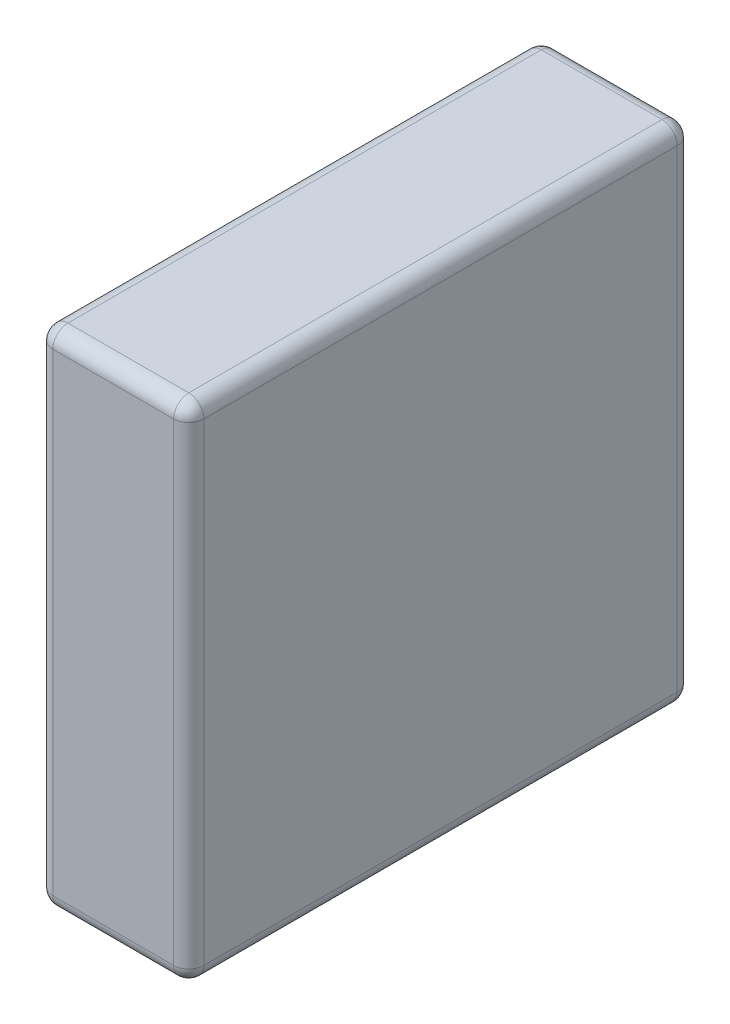
ISO-10303-21;
HEADER;
FILE_DESCRIPTION(('STEP AP214'),'2;1');
FILE_NAME('part.step','',(''),(''),'','','');
FILE_SCHEMA(('AUTOMOTIVE_DESIGN { 1 0 10303 214 1 1 1 1 }'));
ENDSEC;
DATA;
#1=APPLICATION_CONTEXT('core data for automotive mechanical design processes');
#2=APPLICATION_PROTOCOL_DEFINITION('international standard','automotive_design',2000,#1);
#3=PRODUCT_CONTEXT('',#1,'mechanical');
#4=PRODUCT('Part','Part','',(#3));
#5=PRODUCT_RELATED_PRODUCT_CATEGORY('part','',(#4));
#6=PRODUCT_DEFINITION_FORMATION('','',#4);
#7=PRODUCT_DEFINITION_CONTEXT('part definition',#1,'design');
#8=PRODUCT_DEFINITION('design','',#6,#7);
#9=PRODUCT_DEFINITION_SHAPE('','',#8);
#10=(LENGTH_UNIT() NAMED_UNIT(*) SI_UNIT(.MILLI.,.METRE.));
#11=(NAMED_UNIT(*) PLANE_ANGLE_UNIT() SI_UNIT($,.RADIAN.));
#12=(NAMED_UNIT(*) SI_UNIT($,.STERADIAN.) SOLID_ANGLE_UNIT());
#13=UNCERTAINTY_MEASURE_WITH_UNIT(LENGTH_MEASURE(1.E-05),#10,'distance_accuracy_value','');
#14=(GEOMETRIC_REPRESENTATION_CONTEXT(3) GLOBAL_UNCERTAINTY_ASSIGNED_CONTEXT((#13)) GLOBAL_UNIT_ASSIGNED_CONTEXT((#10,
#11,#12)) REPRESENTATION_CONTEXT('',''));
#15=CARTESIAN_POINT('',(0.,0.,0.));
#16=DIRECTION('',(0.,0.,1.));
#17=DIRECTION('',(1.,0.,0.));
#18=AXIS2_PLACEMENT_3D('',#15,#16,#17);
#19=CARTESIAN_POINT('',(25.215,25.745,-0.00960000038147));
#20=DIRECTION('',(1.,0.,0.));
#21=DIRECTION('',(0.,1.,0.));
#22=AXIS2_PLACEMENT_3D('',#19,#20,#21);
#23=PLANE('',#22);
#24=DIRECTION('',(0.,-1.,0.));
#25=VECTOR('',#24,1.);
#26=CARTESIAN_POINT('',(25.215,25.745,-0.479600000381));
#27=LINE('',#26,#25);
#28=CARTESIAN_POINT('',(25.215,26.215,-0.479600000381));
#29=VERTEX_POINT('',#28);
#30=CARTESIAN_POINT('',(25.215,25.745,-0.479600000381));
#31=VERTEX_POINT('',#30);
#32=EDGE_CURVE('E28',#29,#31,#27,.T.);
#33=ORIENTED_EDGE('',*,*,#32,.T.);
#34=DIRECTION('',(0.,0.,1.));
#35=VECTOR('',#34,1.);
#36=CARTESIAN_POINT('',(25.215,25.745,-0.00960000038147));
#37=LINE('',#36,#35);
#38=CARTESIAN_POINT('',(25.215,25.745,-0.00960000038147));
#39=VERTEX_POINT('',#38);
#40=EDGE_CURVE('E11',#31,#39,#37,.T.);
#41=ORIENTED_EDGE('',*,*,#40,.T.);
#42=DIRECTION('',(0.,-1.,0.));
#43=VECTOR('',#42,1.);
#44=CARTESIAN_POINT('',(25.215,25.745,-0.00960000038147));
#45=LINE('',#44,#43);
#46=CARTESIAN_POINT('',(25.215,26.215,-0.00960000038147));
#47=VERTEX_POINT('',#46);
#48=EDGE_CURVE('E222',#47,#39,#45,.T.);
#49=ORIENTED_EDGE('',*,*,#48,.F.);
#50=DIRECTION('',(0.,0.,-1.));
#51=VECTOR('',#50,1.);
#52=CARTESIAN_POINT('',(25.215,26.215,-0.00960000038147));
#53=LINE('',#52,#51);
#54=EDGE_CURVE('E215',#47,#29,#53,.T.);
#55=ORIENTED_EDGE('',*,*,#54,.T.);
#56=EDGE_LOOP('',(#33,#41,#49,#55));
#57=FACE_BOUND('',#56,.T.);
#58=ADVANCED_FACE('F17',(#57),#23,.F.);
#59=CARTESIAN_POINT('',(24.245,25.745,-0.00960000038147));
#60=DIRECTION('',(0.,-1.,0.));
#61=DIRECTION('',(0.,0.,-1.));
#62=AXIS2_PLACEMENT_3D('',#59,#60,#61);
#63=PLANE('',#62);
#64=DIRECTION('',(0.,0.,-1.));
#65=VECTOR('',#64,1.);
#66=CARTESIAN_POINT('',(25.08,25.745,0.00539999961853));
#67=LINE('',#66,#65);
#68=CARTESIAN_POINT('',(25.08,25.745,-0.009600000381464));
#69=VERTEX_POINT('',#68);
#70=CARTESIAN_POINT('',(25.08,25.745,-0.479600000381));
#71=VERTEX_POINT('',#70);
#72=EDGE_CURVE('E265',#69,#71,#67,.T.);
#73=ORIENTED_EDGE('',*,*,#72,.F.);
#74=DIRECTION('',(-1.,0.,0.));
#75=VECTOR('',#74,1.);
#76=CARTESIAN_POINT('',(24.245,25.745,-0.00960000038147));
#77=LINE('',#76,#75);
#78=EDGE_CURVE('E264',#39,#69,#77,.T.);
#79=ORIENTED_EDGE('',*,*,#78,.F.);
#80=ORIENTED_EDGE('',*,*,#40,.F.);
#81=DIRECTION('',(-1.,0.,0.));
#82=VECTOR('',#81,1.);
#83=CARTESIAN_POINT('',(24.245,25.745,-0.479600000381));
#84=LINE('',#83,#82);
#85=EDGE_CURVE('E205',#31,#71,#84,.T.);
#86=ORIENTED_EDGE('',*,*,#85,.T.);
#87=EDGE_LOOP('',(#73,#79,#80,#86));
#88=FACE_BOUND('',#87,.T.);
#89=ADVANCED_FACE('F829',(#88),#63,.F.);
#90=CARTESIAN_POINT('',(25.095,25.745,-0.494600000382));
#91=CARTESIAN_POINT('',(25.095,25.745,-0.494600000382));
#92=CARTESIAN_POINT('',(25.095,25.745,-0.494600000382));
#93=CARTESIAN_POINT('',(25.095,25.745,-0.494600000382));
#94=CARTESIAN_POINT('',(25.094999999997,25.736213203436,-0.494600000382));
#95=CARTESIAN_POINT('',(25.089852813741,25.736213203437,-0.494600000382));
#96=CARTESIAN_POINT('',(25.086213203436,25.739852813744,-0.494600000382));
#97=CARTESIAN_POINT('',(25.086213203436,25.745,-0.494600000382));
#98=CARTESIAN_POINT('',(25.094999999995,25.73,-0.488386796946));
#99=CARTESIAN_POINT('',(25.086213203433,25.730000000003,-0.488386796946));
#100=CARTESIAN_POINT('',(25.08,25.736213203438,-0.488386796946));
#101=CARTESIAN_POINT('',(25.08,25.745,-0.488386796946));
#102=CARTESIAN_POINT('',(25.094999999995,25.73,-0.479600000381));
#103=CARTESIAN_POINT('',(25.086213203433,25.730000000003,-0.479600000381));
#104=CARTESIAN_POINT('',(25.08,25.736213203438,-0.479600000381));
#105=CARTESIAN_POINT('',(25.08,25.745,-0.479600000381));
#106=(BOUNDED_SURFACE() B_SPLINE_SURFACE(3,3,((#90,#91,#92,#93),(#94,#95,#96,#97),(#98,#99,#100,
#101),(#102,#103,#104,#105)),.UNSPECIFIED.,.F.,.F.,.F.) B_SPLINE_SURFACE_WITH_KNOTS((4,4),(4,4),
(0.,1.),(0.,1.),.UNSPECIFIED.) GEOMETRIC_REPRESENTATION_ITEM() RATIONAL_B_SPLINE_SURFACE(((1.,
0.804737854202,0.804737854202,1.),(0.804737854125,0.647603013923,0.647603013923,0.804737854125),
(0.804737854125,0.647603013923,0.647603013923,0.804737854125),(1.,0.804737854202,0.804737854202,1.))) REPRESENTATION_ITEM('') SURFACE());
#107=CARTESIAN_POINT('',(25.095,25.745,-0.479600000381));
#108=DIRECTION('',(0.,0.,1.));
#109=DIRECTION('',(1.,0.,0.));
#110=AXIS2_PLACEMENT_3D('',#107,#108,#109);
#111=CIRCLE('',#110,0.015);
#112=CARTESIAN_POINT('',(25.094999999998,25.73,-0.479600000381));
#113=VERTEX_POINT('',#112);
#114=EDGE_CURVE('E262',#71,#113,#111,.T.);
#115=CARTESIAN_POINT('',(25.095,25.745,-0.479600000381));
#116=DIRECTION('',(0.,1.,0.));
#117=DIRECTION('',(-1.,0.,0.));
#118=AXIS2_PLACEMENT_3D('',#115,#116,#117);
#119=CIRCLE('',#118,0.015);
#120=CARTESIAN_POINT('',(25.095,25.745,-0.494600000382));
#121=VERTEX_POINT('',#120);
#122=EDGE_CURVE('E165',#121,#71,#119,.T.);
#123=CARTESIAN_POINT('',(25.095,25.745,-0.479600000381));
#124=DIRECTION('',(1.,0.,0.));
#125=DIRECTION('',(0.,0.,1.));
#126=AXIS2_PLACEMENT_3D('',#123,#124,#125);
#127=CIRCLE('',#126,0.015);
#128=EDGE_CURVE('E298',#113,#121,#127,.T.);
#129=ORIENTED_EDGE('',*,*,#114,.F.);
#130=ORIENTED_EDGE('',*,*,#122,.F.);
#131=ORIENTED_EDGE('',*,*,#128,.F.);
#132=EDGE_LOOP('',(#129,#130,#131));
#133=FACE_BOUND('',#132,.T.);
#134=ADVANCED_FACE('F388',(#133),#106,.T.);
#135=CARTESIAN_POINT('',(24.245,25.745,-0.479600000381));
#136=DIRECTION('',(0.,0.,-1.));
#137=DIRECTION('',(-1.,0.,0.));
#138=AXIS2_PLACEMENT_3D('',#135,#136,#137);
#139=PLANE('',#138);
#140=DIRECTION('',(0.,1.,0.));
#141=VECTOR('',#140,1.);
#142=CARTESIAN_POINT('',(25.08,26.23,-0.479600000381));
#143=LINE('',#142,#141);
#144=CARTESIAN_POINT('',(25.08,26.215,-0.479600000381));
#145=VERTEX_POINT('',#144);
#146=EDGE_CURVE('E161',#71,#145,#143,.T.);
#147=ORIENTED_EDGE('',*,*,#146,.F.);
#148=ORIENTED_EDGE('',*,*,#85,.F.);
#149=ORIENTED_EDGE('',*,*,#32,.F.);
#150=DIRECTION('',(-1.,0.,0.));
#151=VECTOR('',#150,1.);
#152=CARTESIAN_POINT('',(25.215,26.215,-0.479600000381));
#153=LINE('',#152,#151);
#154=EDGE_CURVE('E203',#29,#145,#153,.T.);
#155=ORIENTED_EDGE('',*,*,#154,.T.);
#156=EDGE_LOOP('',(#147,#148,#149,#155));
#157=FACE_BOUND('',#156,.T.);
#158=ADVANCED_FACE('F392',(#157),#139,.F.);
#159=CARTESIAN_POINT('',(25.215,26.215,-0.00960000038147));
#160=DIRECTION('',(0.,1.,0.));
#161=DIRECTION('',(1.,0.,0.));
#162=AXIS2_PLACEMENT_3D('',#159,#160,#161);
#163=PLANE('',#162);
#164=ORIENTED_EDGE('',*,*,#54,.F.);
#165=DIRECTION('',(1.,0.,0.));
#166=VECTOR('',#165,1.);
#167=CARTESIAN_POINT('',(24.245,26.215,-0.00960000038147));
#168=LINE('',#167,#166);
#169=CARTESIAN_POINT('',(25.08,26.215,-0.00960000038147));
#170=VERTEX_POINT('',#169);
#171=EDGE_CURVE('E230',#170,#47,#168,.T.);
#172=ORIENTED_EDGE('',*,*,#171,.F.);
#173=DIRECTION('',(0.,0.,1.));
#174=VECTOR('',#173,1.);
#175=CARTESIAN_POINT('',(25.08,26.215,0.00539999961853));
#176=LINE('',#175,#174);
#177=EDGE_CURVE('E301',#145,#170,#176,.T.);
#178=ORIENTED_EDGE('',*,*,#177,.F.);
#179=ORIENTED_EDGE('',*,*,#154,.F.);
#180=EDGE_LOOP('',(#164,#172,#178,#179));
#181=FACE_BOUND('',#180,.T.);
#182=ADVANCED_FACE('F394',(#181),#163,.F.);
#183=CARTESIAN_POINT('',(25.095,26.215,-0.494600000381));
#184=CARTESIAN_POINT('',(25.095,26.215,-0.494600000381));
#185=CARTESIAN_POINT('',(25.095,26.215,-0.494600000381));
#186=CARTESIAN_POINT('',(25.095,26.215,-0.494600000381));
#187=CARTESIAN_POINT('',(25.086213203436,26.215,-0.494600000381));
#188=CARTESIAN_POINT('',(25.086213203436,26.220147186258,-0.494600000381));
#189=CARTESIAN_POINT('',(25.089852813742,26.223786796564,-0.494600000381));
#190=CARTESIAN_POINT('',(25.095,26.223786796564,-0.494600000381));
#191=CARTESIAN_POINT('',(25.08,26.215,-0.488386796946));
#192=CARTESIAN_POINT('',(25.08,26.223786796564,-0.488386796946));
#193=CARTESIAN_POINT('',(25.086213203436,26.23,-0.488386796946));
#194=CARTESIAN_POINT('',(25.095,26.23,-0.488386796946));
#195=CARTESIAN_POINT('',(25.08,26.215,-0.479600000381));
#196=CARTESIAN_POINT('',(25.08,26.223786796564,-0.479600000381));
#197=CARTESIAN_POINT('',(25.086213203436,26.23,-0.479600000381));
#198=CARTESIAN_POINT('',(25.095,26.23,-0.479600000381));
#199=(BOUNDED_SURFACE() B_SPLINE_SURFACE(3,3,((#183,#184,#185,#186),(#187,#188,#189,#190),(#191,
#192,#193,#194),(#195,#196,#197,#198)),.UNSPECIFIED.,.F.,.F.,
.F.) B_SPLINE_SURFACE_WITH_KNOTS((4,4),(4,4),(0.,1.),(0.,1.),
.UNSPECIFIED.) GEOMETRIC_REPRESENTATION_ITEM() RATIONAL_B_SPLINE_SURFACE(((1.,0.804737854125,
0.804737854125,1.),(0.804737854123,0.64760301386,0.64760301386,0.804737854123),(0.804737854123,
0.64760301386,0.64760301386,0.804737854123),(1.,0.804737854125,0.804737854125,1.))) REPRESENTATION_ITEM('') SURFACE());
#200=CARTESIAN_POINT('',(25.095,26.215,-0.479600000381));
#201=DIRECTION('',(0.,-1.,0.));
#202=DIRECTION('',(-1.,0.,0.));
#203=AXIS2_PLACEMENT_3D('',#200,#201,#202);
#204=CIRCLE('',#203,0.015);
#205=CARTESIAN_POINT('',(25.095,26.215,-0.494600000381));
#206=VERTEX_POINT('',#205);
#207=EDGE_CURVE('E154',#145,#206,#204,.T.);
#208=CARTESIAN_POINT('',(25.095,26.215,-0.479600000381));
#209=DIRECTION('',(0.,0.,1.));
#210=DIRECTION('',(1.,0.,0.));
#211=AXIS2_PLACEMENT_3D('',#208,#209,#210);
#212=CIRCLE('',#211,0.015);
#213=CARTESIAN_POINT('',(25.095,26.23,-0.479600000381));
#214=VERTEX_POINT('',#213);
#215=EDGE_CURVE('E173',#214,#145,#212,.T.);
#216=CARTESIAN_POINT('',(25.095,26.215,-0.479600000381));
#217=DIRECTION('',(1.,0.,0.));
#218=DIRECTION('',(0.,0.,-1.));
#219=AXIS2_PLACEMENT_3D('',#216,#217,#218);
#220=CIRCLE('',#219,0.015);
#221=EDGE_CURVE('E169',#206,#214,#220,.T.);
#222=ORIENTED_EDGE('',*,*,#207,.F.);
#223=ORIENTED_EDGE('',*,*,#215,.F.);
#224=ORIENTED_EDGE('',*,*,#221,.F.);
#225=EDGE_LOOP('',(#222,#223,#224));
#226=FACE_BOUND('',#225,.T.);
#227=ADVANCED_FACE('F171',(#226),#199,.T.);
#228=CARTESIAN_POINT('',(25.08,26.215,-0.00960000038147));
#229=CARTESIAN_POINT('',(25.08,26.223786796564,-0.00960000038147));
#230=CARTESIAN_POINT('',(25.086213203436,26.23,-0.00960000038147));
#231=CARTESIAN_POINT('',(25.095,26.23,-0.00960000038147));
#232=CARTESIAN_POINT('',(25.08,26.215,-0.0008132038170511));
#233=CARTESIAN_POINT('',(25.08,26.223786796564,-0.0008132038170511));
#234=CARTESIAN_POINT('',(25.086213203436,26.23,-0.0008132038170511));
#235=CARTESIAN_POINT('',(25.095,26.23,-0.0008132038170511));
#236=CARTESIAN_POINT('',(25.086213203436,26.215,0.005399999618547));
#237=CARTESIAN_POINT('',(25.086213203436,26.220147186258,0.005399999618547));
#238=CARTESIAN_POINT('',(25.089852813742,26.223786796564,0.005399999618547));
#239=CARTESIAN_POINT('',(25.095,26.223786796564,0.005399999618547));
#240=CARTESIAN_POINT('',(25.095,26.215,0.005399999618547));
#241=CARTESIAN_POINT('',(25.095,26.215,0.005399999618547));
#242=CARTESIAN_POINT('',(25.095,26.215,0.005399999618547));
#243=CARTESIAN_POINT('',(25.095,26.215,0.005399999618547));
#244=(BOUNDED_SURFACE() B_SPLINE_SURFACE(3,3,((#228,#229,#230,#231),(#232,#233,#234,#235),(#236,
#237,#238,#239),(#240,#241,#242,#243)),.UNSPECIFIED.,.F.,.F.,
.F.) B_SPLINE_SURFACE_WITH_KNOTS((4,4),(4,4),(0.,1.),(0.,1.),
.UNSPECIFIED.) GEOMETRIC_REPRESENTATION_ITEM() RATIONAL_B_SPLINE_SURFACE(((1.,0.804737854124,
0.804737854124,1.),(0.804737854125,0.647603013861,0.647603013861,0.804737854125),
(0.804737854125,0.647603013861,0.647603013861,0.804737854125),(1.,0.804737854124,0.804737854124,1.))) REPRESENTATION_ITEM('') SURFACE());
#245=CARTESIAN_POINT('',(25.095,26.215,-0.00960000038147));
#246=DIRECTION('',(1.,0.,0.));
#247=DIRECTION('',(0.,0.,-1.));
#248=AXIS2_PLACEMENT_3D('',#245,#246,#247);
#249=CIRCLE('',#248,0.015);
#250=CARTESIAN_POINT('',(25.095,26.23,-0.00960000038147));
#251=VERTEX_POINT('',#250);
#252=CARTESIAN_POINT('',(25.095,26.215,0.005399999618539));
#253=VERTEX_POINT('',#252);
#254=EDGE_CURVE('E178',#251,#253,#249,.T.);
#255=CARTESIAN_POINT('',(25.095,26.215,-0.00960000038147));
#256=DIRECTION('',(0.,0.,-1.));
#257=DIRECTION('',(1.,0.,0.));
#258=AXIS2_PLACEMENT_3D('',#255,#256,#257);
#259=CIRCLE('',#258,0.015);
#260=EDGE_CURVE('E166',#170,#251,#259,.T.);
#261=CARTESIAN_POINT('',(25.095,26.215,-0.00960000038147));
#262=DIRECTION('',(0.,-1.,0.));
#263=DIRECTION('',(-1.,0.,0.));
#264=AXIS2_PLACEMENT_3D('',#261,#262,#263);
#265=CIRCLE('',#264,0.015);
#266=EDGE_CURVE('E260',#253,#170,#265,.T.);
#267=ORIENTED_EDGE('',*,*,#254,.F.);
#268=ORIENTED_EDGE('',*,*,#260,.F.);
#269=ORIENTED_EDGE('',*,*,#266,.F.);
#270=EDGE_LOOP('',(#267,#268,#269));
#271=FACE_BOUND('',#270,.T.);
#272=ADVANCED_FACE('F791',(#271),#244,.T.);
#273=CARTESIAN_POINT('',(24.245,25.745,-0.00960000038147));
#274=DIRECTION('',(0.,0.,-1.));
#275=DIRECTION('',(-1.,0.,0.));
#276=AXIS2_PLACEMENT_3D('',#273,#274,#275);
#277=PLANE('',#276);
#278=ORIENTED_EDGE('',*,*,#78,.T.);
#279=DIRECTION('',(0.,-1.,0.));
#280=VECTOR('',#279,1.);
#281=CARTESIAN_POINT('',(25.08,26.23,-0.00960000038147));
#282=LINE('',#281,#280);
#283=EDGE_CURVE('E261',#170,#69,#282,.T.);
#284=ORIENTED_EDGE('',*,*,#283,.F.);
#285=ORIENTED_EDGE('',*,*,#171,.T.);
#286=ORIENTED_EDGE('',*,*,#48,.T.);
#287=EDGE_LOOP('',(#278,#284,#285,#286));
#288=FACE_BOUND('',#287,.T.);
#289=ADVANCED_FACE('F783',(#288),#277,.T.);
#290=CARTESIAN_POINT('',(25.095,25.745,0.005399999618553));
#291=CARTESIAN_POINT('',(25.095,25.736213203404,0.005399999618553));
#292=CARTESIAN_POINT('',(25.095,25.729999999961,-0.0008132038529123));
#293=CARTESIAN_POINT('',(25.095,25.73,-0.009600000448414));
#294=CARTESIAN_POINT('',(25.086213203436,25.745,0.005399999618581));
#295=CARTESIAN_POINT('',(25.086213203436,25.736213203405,0.005399999618581));
#296=CARTESIAN_POINT('',(25.086213203436,25.729999999961,-0.000813203852894));
#297=CARTESIAN_POINT('',(25.086213203436,25.73,-0.009600000448414));
#298=CARTESIAN_POINT('',(25.08,25.745,-0.0008132038170103));
#299=CARTESIAN_POINT('',(25.08,25.739852813724,-0.000813203817010301));
#300=CARTESIAN_POINT('',(25.08,25.736213203413,-0.004452814144821));
#301=CARTESIAN_POINT('',(25.08,25.736213203436,-0.009600000420665));
#302=CARTESIAN_POINT('',(25.08,25.745,-0.009600000381421));
#303=CARTESIAN_POINT('',(25.08,25.745,-0.009600000381421));
#304=CARTESIAN_POINT('',(25.08,25.745,-0.00960000038142301));
#305=CARTESIAN_POINT('',(25.08,25.745,-0.009600000381423));
#306=(BOUNDED_SURFACE() B_SPLINE_SURFACE(3,3,((#290,#291,#292,#293),(#294,#295,#296,#297),(#298,
#299,#300,#301),(#302,#303,#304,#305)),.UNSPECIFIED.,.F.,.F.,
.F.) B_SPLINE_SURFACE_WITH_KNOTS((4,4),(4,4),(0.,1.),(0.,1.),
.UNSPECIFIED.) GEOMETRIC_REPRESENTATION_ITEM() RATIONAL_B_SPLINE_SURFACE(((1.,0.804737853072,
0.804737853072,1.),(0.804737854124,0.647603013013,0.647603013013,0.804737854124),
(0.804737854124,0.647603013013,0.647603013013,0.804737854124),(1.,0.804737853072,0.804737853072,1.))) REPRESENTATION_ITEM('') SURFACE());
#307=CARTESIAN_POINT('',(25.095,25.745,-0.00960000038147));
#308=DIRECTION('',(1.,0.,0.));
#309=DIRECTION('',(0.,0.,1.));
#310=AXIS2_PLACEMENT_3D('',#307,#308,#309);
#311=CIRCLE('',#310,0.015);
#312=CARTESIAN_POINT('',(25.095,25.745,0.005399999618541));
#313=VERTEX_POINT('',#312);
#314=CARTESIAN_POINT('',(25.095,25.73,-0.009600000414942));
#315=VERTEX_POINT('',#314);
#316=EDGE_CURVE('E313',#313,#315,#311,.T.);
#317=CARTESIAN_POINT('',(25.095,25.745,-0.00960000038147));
#318=DIRECTION('',(0.,1.,0.));
#319=DIRECTION('',(-1.,0.,0.));
#320=AXIS2_PLACEMENT_3D('',#317,#318,#319);
#321=CIRCLE('',#320,0.015);
#322=EDGE_CURVE('E256',#69,#313,#321,.T.);
#323=CARTESIAN_POINT('',(25.095,25.745,-0.00960000038147));
#324=DIRECTION('',(0.,0.,-1.));
#325=DIRECTION('',(1.,0.,0.));
#326=AXIS2_PLACEMENT_3D('',#323,#324,#325);
#327=CIRCLE('',#326,0.015);
#328=EDGE_CURVE('E145',#315,#69,#327,.T.);
#329=ORIENTED_EDGE('',*,*,#316,.F.);
#330=ORIENTED_EDGE('',*,*,#322,.F.);
#331=ORIENTED_EDGE('',*,*,#328,.F.);
#332=EDGE_LOOP('',(#329,#330,#331));
#333=FACE_BOUND('',#332,.T.);
#334=ADVANCED_FACE('F775',(#333),#306,.T.);
#335=CARTESIAN_POINT('',(25.095,25.745,0.00539999961853));
#336=DIRECTION('',(0.,0.,1.));
#337=DIRECTION('',(1.,0.,0.));
#338=AXIS2_PLACEMENT_3D('',#335,#336,#337);
#339=CYLINDRICAL_SURFACE('',#338,0.015);
#340=ORIENTED_EDGE('',*,*,#328,.T.);
#341=ORIENTED_EDGE('',*,*,#72,.T.);
#342=ORIENTED_EDGE('',*,*,#114,.T.);
#343=DIRECTION('',(0.,0.,-1.));
#344=VECTOR('',#343,1.);
#345=CARTESIAN_POINT('',(25.095,25.73,0.00539999961853));
#346=LINE('',#345,#344);
#347=EDGE_CURVE('E21',#315,#113,#346,.T.);
#348=ORIENTED_EDGE('',*,*,#347,.F.);
#349=EDGE_LOOP('',(#340,#341,#342,#348));
#350=FACE_BOUND('',#349,.T.);
#351=ADVANCED_FACE('F391',(#350),#339,.T.);
#352=CARTESIAN_POINT('',(25.08,25.745,-0.479600000381));
#353=DIRECTION('',(-1.,0.,0.));
#354=DIRECTION('',(0.,0.,1.));
#355=AXIS2_PLACEMENT_3D('',#352,#353,#354);
#356=CYLINDRICAL_SURFACE('',#355,0.015);
#357=ORIENTED_EDGE('',*,*,#128,.T.);
#358=DIRECTION('',(-1.,0.,0.));
#359=VECTOR('',#358,1.);
#360=CARTESIAN_POINT('',(25.08,25.745,-0.494600000381));
#361=LINE('',#360,#359);
#362=CARTESIAN_POINT('',(25.215,25.745,-0.494600000381));
#363=VERTEX_POINT('',#362);
#364=EDGE_CURVE('E188',#363,#121,#361,.T.);
#365=ORIENTED_EDGE('',*,*,#364,.F.);
#366=CARTESIAN_POINT('',(25.215,25.745,-0.479600000381));
#367=DIRECTION('',(1.,1.122566481878E-13,1.57939104496947E-12));
#368=DIRECTION('',(-1.579391044969E-12,-4.16333634234E-12,1.));
#369=AXIS2_PLACEMENT_3D('',#366,#367,#368);
#370=CIRCLE('',#369,0.01500000000002);
#371=CARTESIAN_POINT('',(25.215,25.73,-0.479600000381));
#372=VERTEX_POINT('',#371);
#373=EDGE_CURVE('E307',#372,#363,#370,.T.);
#374=ORIENTED_EDGE('',*,*,#373,.F.);
#375=DIRECTION('',(1.,0.,0.));
#376=VECTOR('',#375,1.);
#377=CARTESIAN_POINT('',(25.08,25.73,-0.479600000381));
#378=LINE('',#377,#376);
#379=EDGE_CURVE('E275',#113,#372,#378,.T.);
#380=ORIENTED_EDGE('',*,*,#379,.F.);
#381=EDGE_LOOP('',(#357,#365,#374,#380));
#382=FACE_BOUND('',#381,.T.);
#383=ADVANCED_FACE('F384',(#382),#356,.T.);
#384=CARTESIAN_POINT('',(25.095,26.23,-0.479600000381));
#385=DIRECTION('',(0.,1.,0.));
#386=DIRECTION('',(-1.,0.,0.));
#387=AXIS2_PLACEMENT_3D('',#384,#385,#386);
#388=CYLINDRICAL_SURFACE('',#387,0.015);
#389=ORIENTED_EDGE('',*,*,#207,.T.);
#390=DIRECTION('',(0.,1.,0.));
#391=VECTOR('',#390,1.);
#392=CARTESIAN_POINT('',(25.095,25.73,-0.494600000381));
#393=LINE('',#392,#391);
#394=EDGE_CURVE('E159',#121,#206,#393,.T.);
#395=ORIENTED_EDGE('',*,*,#394,.F.);
#396=ORIENTED_EDGE('',*,*,#122,.T.);
#397=ORIENTED_EDGE('',*,*,#146,.T.);
#398=EDGE_LOOP('',(#389,#395,#396,#397));
#399=FACE_BOUND('',#398,.T.);
#400=ADVANCED_FACE('F156',(#399),#388,.T.);
#401=CARTESIAN_POINT('',(25.095,26.215,0.00539999961853));
#402=DIRECTION('',(0.,0.,1.));
#403=DIRECTION('',(1.,0.,0.));
#404=AXIS2_PLACEMENT_3D('',#401,#402,#403);
#405=CYLINDRICAL_SURFACE('',#404,0.015);
#406=ORIENTED_EDGE('',*,*,#215,.T.);
#407=ORIENTED_EDGE('',*,*,#177,.T.);
#408=ORIENTED_EDGE('',*,*,#260,.T.);
#409=DIRECTION('',(0.,0.,1.));
#410=VECTOR('',#409,1.);
#411=CARTESIAN_POINT('',(25.095,26.23,0.00539999961853));
#412=LINE('',#411,#410);
#413=EDGE_CURVE('E235',#214,#251,#412,.T.);
#414=ORIENTED_EDGE('',*,*,#413,.F.);
#415=EDGE_LOOP('',(#406,#407,#408,#414));
#416=FACE_BOUND('',#415,.T.);
#417=ADVANCED_FACE('F397',(#416),#405,.T.);
#418=CARTESIAN_POINT('',(25.23,26.215,-0.479600000381));
#419=DIRECTION('',(1.,0.,0.));
#420=DIRECTION('',(0.,0.,-1.));
#421=AXIS2_PLACEMENT_3D('',#418,#419,#420);
#422=CYLINDRICAL_SURFACE('',#421,0.015);
#423=CARTESIAN_POINT('',(25.215,26.215,-0.479600000381));
#424=DIRECTION('',(1.,0.,0.));
#425=DIRECTION('',(0.,-4.625929269272E-13,-1.));
#426=AXIS2_PLACEMENT_3D('',#423,#424,#425);
#427=CIRCLE('',#426,0.015);
#428=CARTESIAN_POINT('',(25.215,26.215,-0.494600000381));
#429=VERTEX_POINT('',#428);
#430=CARTESIAN_POINT('',(25.215,26.23,-0.479600000381));
#431=VERTEX_POINT('',#430);
#432=EDGE_CURVE('E183',#429,#431,#427,.T.);
#433=ORIENTED_EDGE('',*,*,#432,.F.);
#434=DIRECTION('',(1.,0.,0.));
#435=VECTOR('',#434,1.);
#436=CARTESIAN_POINT('',(25.08,26.215,-0.494600000381));
#437=LINE('',#436,#435);
#438=EDGE_CURVE('E181',#206,#429,#437,.T.);
#439=ORIENTED_EDGE('',*,*,#438,.F.);
#440=ORIENTED_EDGE('',*,*,#221,.T.);
#441=DIRECTION('',(-1.,0.,0.));
#442=VECTOR('',#441,1.);
#443=CARTESIAN_POINT('',(25.23,26.23,-0.479600000381));
#444=LINE('',#443,#442);
#445=EDGE_CURVE('E239',#431,#214,#444,.T.);
#446=ORIENTED_EDGE('',*,*,#445,.F.);
#447=EDGE_LOOP('',(#433,#439,#440,#446));
#448=FACE_BOUND('',#447,.T.);
#449=ADVANCED_FACE('F182',(#448),#422,.T.);
#450=CARTESIAN_POINT('',(25.23,26.215,-0.00960000038147));
#451=DIRECTION('',(1.,0.,0.));
#452=DIRECTION('',(0.,0.,-1.));
#453=AXIS2_PLACEMENT_3D('',#450,#451,#452);
#454=CYLINDRICAL_SURFACE('',#453,0.015);
#455=DIRECTION('',(1.,0.,0.));
#456=VECTOR('',#455,1.);
#457=CARTESIAN_POINT('',(25.23,26.23,-0.00960000038147));
#458=LINE('',#457,#456);
#459=CARTESIAN_POINT('',(25.215,26.23,-0.00960000038147));
#460=VERTEX_POINT('',#459);
#461=EDGE_CURVE('E199',#251,#460,#458,.T.);
#462=ORIENTED_EDGE('',*,*,#461,.F.);
#463=ORIENTED_EDGE('',*,*,#254,.T.);
#464=DIRECTION('',(1.,0.,0.));
#465=VECTOR('',#464,1.);
#466=CARTESIAN_POINT('',(25.08,26.215,0.00539999961853));
#467=LINE('',#466,#465);
#468=CARTESIAN_POINT('',(25.215,26.215,0.005399999618535));
#469=VERTEX_POINT('',#468);
#470=EDGE_CURVE('E250',#253,#469,#467,.T.);
#471=ORIENTED_EDGE('',*,*,#470,.T.);
#472=CARTESIAN_POINT('',(25.215,26.215,-0.00960000038147));
#473=DIRECTION('',(1.,-5.392378326014E-12,-5.392378326003E-12));
#474=DIRECTION('',(5.392378326014E-12,1.,0.));
#475=AXIS2_PLACEMENT_3D('',#472,#473,#474);
#476=CIRCLE('',#475,0.01500000000002);
#477=EDGE_CURVE('E271',#460,#469,#476,.T.);
#478=ORIENTED_EDGE('',*,*,#477,.F.);
#479=EDGE_LOOP('',(#462,#463,#471,#478));
#480=FACE_BOUND('',#479,.T.);
#481=ADVANCED_FACE('F729',(#480),#454,.T.);
#482=CARTESIAN_POINT('',(25.08,25.745,-0.00960000038147));
#483=DIRECTION('',(-1.,0.,0.));
#484=DIRECTION('',(0.,0.,1.));
#485=AXIS2_PLACEMENT_3D('',#482,#483,#484);
#486=CYLINDRICAL_SURFACE('',#485,0.015);
#487=DIRECTION('',(-1.,0.,0.));
#488=VECTOR('',#487,1.);
#489=CARTESIAN_POINT('',(25.08,25.73,-0.00960000038147));
#490=LINE('',#489,#488);
#491=CARTESIAN_POINT('',(25.215,25.73,-0.009600000381462));
#492=VERTEX_POINT('',#491);
#493=EDGE_CURVE('E310',#492,#315,#490,.T.);
#494=ORIENTED_EDGE('',*,*,#493,.F.);
#495=CARTESIAN_POINT('',(25.215,25.745,-0.009600000381443));
#496=DIRECTION('',(1.,-1.974238806212E-12,0.));
#497=DIRECTION('',(1.974238806212E-12,1.,-1.07064964533E-13));
#498=AXIS2_PLACEMENT_3D('',#495,#496,#497);
#499=CIRCLE('',#498,0.01499999999999);
#500=CARTESIAN_POINT('',(25.215,25.745,0.005399999618534));
#501=VERTEX_POINT('',#500);
#502=EDGE_CURVE('E267',#501,#492,#499,.T.);
#503=ORIENTED_EDGE('',*,*,#502,.F.);
#504=DIRECTION('',(-1.,0.,0.));
#505=VECTOR('',#504,1.);
#506=CARTESIAN_POINT('',(25.08,25.745,0.00539999961853));
#507=LINE('',#506,#505);
#508=EDGE_CURVE('E246',#501,#313,#507,.T.);
#509=ORIENTED_EDGE('',*,*,#508,.T.);
#510=ORIENTED_EDGE('',*,*,#316,.T.);
#511=EDGE_LOOP('',(#494,#503,#509,#510));
#512=FACE_BOUND('',#511,.T.);
#513=ADVANCED_FACE('F718',(#512),#486,.T.);
#514=CARTESIAN_POINT('',(25.095,26.23,-0.00960000038147));
#515=DIRECTION('',(0.,1.,0.));
#516=DIRECTION('',(-1.,0.,0.));
#517=AXIS2_PLACEMENT_3D('',#514,#515,#516);
#518=CYLINDRICAL_SURFACE('',#517,0.015);
#519=ORIENTED_EDGE('',*,*,#283,.T.);
#520=ORIENTED_EDGE('',*,*,#322,.T.);
#521=DIRECTION('',(0.,1.,0.));
#522=VECTOR('',#521,1.);
#523=CARTESIAN_POINT('',(25.095,25.73,0.00539999961853));
#524=LINE('',#523,#522);
#525=EDGE_CURVE('E255',#313,#253,#524,.T.);
#526=ORIENTED_EDGE('',*,*,#525,.T.);
#527=ORIENTED_EDGE('',*,*,#266,.T.);
#528=EDGE_LOOP('',(#519,#520,#526,#527));
#529=FACE_BOUND('',#528,.T.);
#530=ADVANCED_FACE('F708',(#529),#518,.T.);
#531=CARTESIAN_POINT('',(25.08,25.73,0.00539999961853));
#532=DIRECTION('',(0.,-1.,0.));
#533=DIRECTION('',(0.,0.,-1.));
#534=AXIS2_PLACEMENT_3D('',#531,#532,#533);
#535=PLANE('',#534);
#536=ORIENTED_EDGE('',*,*,#493,.T.);
#537=ORIENTED_EDGE('',*,*,#347,.T.);
#538=ORIENTED_EDGE('',*,*,#379,.T.);
#539=DIRECTION('',(0.,0.,-1.));
#540=VECTOR('',#539,1.);
#541=CARTESIAN_POINT('',(25.215,25.73,0.00539999961853));
#542=LINE('',#541,#540);
#543=EDGE_CURVE('E240',#492,#372,#542,.T.);
#544=ORIENTED_EDGE('',*,*,#543,.F.);
#545=EDGE_LOOP('',(#536,#537,#538,#544));
#546=FACE_BOUND('',#545,.T.);
#547=ADVANCED_FACE('F423',(#546),#535,.T.);
#548=CARTESIAN_POINT('',(25.215,25.73,-0.479600000382));
#549=CARTESIAN_POINT('',(25.223786796528,25.73,-0.479600000382));
#550=CARTESIAN_POINT('',(25.229999999954,25.736213203394,-0.479600000382));
#551=CARTESIAN_POINT('',(25.23,25.744999999922,-0.479600000381));
#552=CARTESIAN_POINT('',(25.215,25.73,-0.488386796946));
#553=CARTESIAN_POINT('',(25.223786796528,25.73,-0.488386796946));
#554=CARTESIAN_POINT('',(25.229999999954,25.736213203394,-0.488386796946));
#555=CARTESIAN_POINT('',(25.23,25.744999999922,-0.488386796946));
#556=CARTESIAN_POINT('',(25.215,25.736213203436,-0.494600000381));
#557=CARTESIAN_POINT('',(25.220147186236,25.736213203436,-0.494600000381));
#558=CARTESIAN_POINT('',(25.223786796538,25.739852813718,-0.494600000381));
#559=CARTESIAN_POINT('',(25.223786796564,25.744999999954,-0.494600000381));
#560=CARTESIAN_POINT('',(25.215,25.745,-0.494600000381));
#561=CARTESIAN_POINT('',(25.215,25.745,-0.494600000381));
#562=CARTESIAN_POINT('',(25.215,25.745,-0.494600000381));
#563=CARTESIAN_POINT('',(25.215,25.745,-0.494600000381));
#564=(BOUNDED_SURFACE() B_SPLINE_SURFACE(3,3,((#548,#549,#550,#551),(#552,#553,#554,#555),(#556,
#557,#558,#559),(#560,#561,#562,#563)),.UNSPECIFIED.,.F.,.F.,
.F.) B_SPLINE_SURFACE_WITH_KNOTS((4,4),(4,4),(0.,1.),(0.,1.),
.UNSPECIFIED.) GEOMETRIC_REPRESENTATION_ITEM() RATIONAL_B_SPLINE_SURFACE(((1.,0.804737855357,
0.804737855357,1.),(0.804737854125,0.647603014853,0.647603014853,0.804737854125),
(0.804737854125,0.647603014853,0.647603014853,0.804737854125),(1.,0.804737855357,0.804737855357,1.))) REPRESENTATION_ITEM('') SURFACE());
#565=CARTESIAN_POINT('',(25.215,25.745,-0.479600000381));
#566=DIRECTION('',(0.,0.,1.));
#567=DIRECTION('',(1.,0.,0.));
#568=AXIS2_PLACEMENT_3D('',#565,#566,#567);
#569=CIRCLE('',#568,0.015);
#570=CARTESIAN_POINT('',(25.23,25.744999999961,-0.479600000381));
#571=VERTEX_POINT('',#570);
#572=EDGE_CURVE('E244',#372,#571,#569,.T.);
#573=CARTESIAN_POINT('',(25.215,25.745,-0.479600000381));
#574=DIRECTION('',(0.,1.,0.));
#575=DIRECTION('',(1.,0.,0.));
#576=AXIS2_PLACEMENT_3D('',#573,#574,#575);
#577=CIRCLE('',#576,0.015);
#578=EDGE_CURVE('E280',#571,#363,#577,.T.);
#579=ORIENTED_EDGE('',*,*,#572,.F.);
#580=ORIENTED_EDGE('',*,*,#373,.T.);
#581=ORIENTED_EDGE('',*,*,#578,.F.);
#582=EDGE_LOOP('',(#579,#580,#581));
#583=FACE_BOUND('',#582,.T.);
#584=ADVANCED_FACE('F419',(#583),#564,.T.);
#585=CARTESIAN_POINT('',(25.08,25.73,-0.494600000381));
#586=DIRECTION('',(0.,0.,-1.));
#587=DIRECTION('',(-1.,0.,0.));
#588=AXIS2_PLACEMENT_3D('',#585,#586,#587);
#589=PLANE('',#588);
#590=ORIENTED_EDGE('',*,*,#394,.T.);
#591=ORIENTED_EDGE('',*,*,#438,.T.);
#592=DIRECTION('',(0.,1.,0.));
#593=VECTOR('',#592,1.);
#594=CARTESIAN_POINT('',(25.215,25.73,-0.494600000381));
#595=LINE('',#594,#593);
#596=EDGE_CURVE('E276',#363,#429,#595,.T.);
#597=ORIENTED_EDGE('',*,*,#596,.F.);
#598=ORIENTED_EDGE('',*,*,#364,.T.);
#599=EDGE_LOOP('',(#590,#591,#597,#598));
#600=FACE_BOUND('',#599,.T.);
#601=ADVANCED_FACE('F191',(#600),#589,.T.);
#602=CARTESIAN_POINT('',(25.215,26.215,-0.494600000381));
#603=CARTESIAN_POINT('',(25.215,26.215,-0.494600000381));
#604=CARTESIAN_POINT('',(25.215,26.215,-0.494600000381));
#605=CARTESIAN_POINT('',(25.215,26.215,-0.494600000381));
#606=CARTESIAN_POINT('',(25.215,26.223786796564,-0.494600000381));
#607=CARTESIAN_POINT('',(25.220147186258,26.223786796564,-0.494600000381));
#608=CARTESIAN_POINT('',(25.223786796564,26.220147186258,-0.494600000381));
#609=CARTESIAN_POINT('',(25.223786796564,26.215,-0.494600000381));
#610=CARTESIAN_POINT('',(25.215,26.23,-0.488386796946));
#611=CARTESIAN_POINT('',(25.223786796564,26.23,-0.488386796946));
#612=CARTESIAN_POINT('',(25.23,26.223786796564,-0.488386796946));
#613=CARTESIAN_POINT('',(25.23,26.215,-0.488386796946));
#614=CARTESIAN_POINT('',(25.215,26.23,-0.479600000381));
#615=CARTESIAN_POINT('',(25.223786796564,26.23,-0.479600000381));
#616=CARTESIAN_POINT('',(25.23,26.223786796564,-0.479600000381));
#617=CARTESIAN_POINT('',(25.23,26.215,-0.479600000381));
#618=(BOUNDED_SURFACE() B_SPLINE_SURFACE(3,3,((#602,#603,#604,#605),(#606,#607,#608,#609),(#610,
#611,#612,#613),(#614,#615,#616,#617)),.UNSPECIFIED.,.F.,.F.,
.F.) B_SPLINE_SURFACE_WITH_KNOTS((4,4),(4,4),(0.,1.),(0.,1.),
.UNSPECIFIED.) GEOMETRIC_REPRESENTATION_ITEM() RATIONAL_B_SPLINE_SURFACE(((1.,0.804737854124,
0.804737854124,1.),(0.804737854124,0.647603013861,0.647603013861,0.804737854124),
(0.804737854124,0.647603013861,0.647603013861,0.804737854124),(1.,0.804737854124,0.804737854124,1.))) REPRESENTATION_ITEM('') SURFACE());
#619=CARTESIAN_POINT('',(25.215,26.215,-0.479600000381));
#620=DIRECTION('',(0.,0.,1.));
#621=DIRECTION('',(1.,0.,0.));
#622=AXIS2_PLACEMENT_3D('',#619,#620,#621);
#623=CIRCLE('',#622,0.015);
#624=CARTESIAN_POINT('',(25.23,26.215,-0.479600000381));
#625=VERTEX_POINT('',#624);
#626=EDGE_CURVE('E306',#625,#431,#623,.T.);
#627=CARTESIAN_POINT('',(25.215,26.215,-0.479600000381));
#628=DIRECTION('',(0.,-1.,0.));
#629=DIRECTION('',(1.,0.,0.));
#630=AXIS2_PLACEMENT_3D('',#627,#628,#629);
#631=CIRCLE('',#630,0.015);
#632=EDGE_CURVE('E245',#429,#625,#631,.T.);
#633=ORIENTED_EDGE('',*,*,#626,.F.);
#634=ORIENTED_EDGE('',*,*,#632,.F.);
#635=ORIENTED_EDGE('',*,*,#432,.T.);
#636=EDGE_LOOP('',(#633,#634,#635));
#637=FACE_BOUND('',#636,.T.);
#638=ADVANCED_FACE('F409',(#637),#618,.T.);
#639=CARTESIAN_POINT('',(25.23,26.23,0.00539999961853));
#640=DIRECTION('',(0.,1.,0.));
#641=DIRECTION('',(1.,0.,0.));
#642=AXIS2_PLACEMENT_3D('',#639,#640,#641);
#643=PLANE('',#642);
#644=DIRECTION('',(0.,0.,1.));
#645=VECTOR('',#644,1.);
#646=CARTESIAN_POINT('',(25.215,26.23,0.00539999961853));
#647=LINE('',#646,#645);
#648=EDGE_CURVE('E290',#431,#460,#647,.T.);
#649=ORIENTED_EDGE('',*,*,#648,.F.);
#650=ORIENTED_EDGE('',*,*,#445,.T.);
#651=ORIENTED_EDGE('',*,*,#413,.T.);
#652=ORIENTED_EDGE('',*,*,#461,.T.);
#653=EDGE_LOOP('',(#649,#650,#651,#652));
#654=FACE_BOUND('',#653,.T.);
#655=ADVANCED_FACE('F401',(#654),#643,.T.);
#656=CARTESIAN_POINT('',(25.215,25.745,0.005399999618542));
#657=CARTESIAN_POINT('',(25.223786796584,25.745,0.005399999618542));
#658=CARTESIAN_POINT('',(25.230000000025,25.745,-0.000813203839468));
#659=CARTESIAN_POINT('',(25.23,25.745,-0.009600000423306));
#660=CARTESIAN_POINT('',(25.215,25.736213203436,0.005399999618563));
#661=CARTESIAN_POINT('',(25.223786796584,25.736213203436,0.005399999618561));
#662=CARTESIAN_POINT('',(25.230000000025,25.736213203436,-0.000813203839459301));
#663=CARTESIAN_POINT('',(25.23,25.736213203436,-0.00960000042330901));
#664=CARTESIAN_POINT('',(25.215,25.73,-0.0008132038170294));
#665=CARTESIAN_POINT('',(25.220147186269,25.73,-0.0008132038170294));
#666=CARTESIAN_POINT('',(25.223786796579,25.73,-0.004452814136951));
#667=CARTESIAN_POINT('',(25.223786796564,25.73,-0.009600000405962));
#668=CARTESIAN_POINT('',(25.215,25.73,-0.009600000381439));
#669=CARTESIAN_POINT('',(25.215,25.73,-0.009600000381439));
#670=CARTESIAN_POINT('',(25.215,25.73,-0.009600000381436));
#671=CARTESIAN_POINT('',(25.215,25.73,-0.00960000038144));
#672=(BOUNDED_SURFACE() B_SPLINE_SURFACE(3,3,((#656,#657,#658,#659),(#660,#661,#662,#663),(#664,
#665,#666,#667),(#668,#669,#670,#671)),.UNSPECIFIED.,.F.,.F.,
.F.) B_SPLINE_SURFACE_WITH_KNOTS((4,4),(4,4),(0.,1.),(0.,1.),
.UNSPECIFIED.) GEOMETRIC_REPRESENTATION_ITEM() RATIONAL_B_SPLINE_SURFACE(((1.,0.804737853467,
0.804737853467,1.),(0.804737854124,0.647603013331,0.647603013331,0.804737854124),
(0.804737854124,0.647603013331,0.647603013331,0.804737854124),(1.,0.804737853467,0.804737853467,1.))) REPRESENTATION_ITEM('') SURFACE());
#673=CARTESIAN_POINT('',(25.215,25.745,-0.00960000038147));
#674=DIRECTION('',(0.,1.,0.));
#675=DIRECTION('',(1.,0.,0.));
#676=AXIS2_PLACEMENT_3D('',#673,#674,#675);
#677=CIRCLE('',#676,0.015);
#678=CARTESIAN_POINT('',(25.23,25.745,-0.009600000402386));
#679=VERTEX_POINT('',#678);
#680=EDGE_CURVE('E302',#501,#679,#677,.T.);
#681=CARTESIAN_POINT('',(25.215,25.745,-0.00960000038147));
#682=DIRECTION('',(0.,0.,-1.));
#683=DIRECTION('',(1.,0.,0.));
#684=AXIS2_PLACEMENT_3D('',#681,#682,#683);
#685=CIRCLE('',#684,0.015);
#686=EDGE_CURVE('E251',#679,#492,#685,.T.);
#687=ORIENTED_EDGE('',*,*,#680,.F.);
#688=ORIENTED_EDGE('',*,*,#502,.T.);
#689=ORIENTED_EDGE('',*,*,#686,.F.);
#690=EDGE_LOOP('',(#687,#688,#689));
#691=FACE_BOUND('',#690,.T.);
#692=ADVANCED_FACE('F653',(#691),#672,.T.);
#693=CARTESIAN_POINT('',(25.215,26.23,-0.00960000038147));
#694=CARTESIAN_POINT('',(25.215,26.23,-0.00960000038147));
#695=CARTESIAN_POINT('',(25.215,26.23,-0.009600000381468));
#696=CARTESIAN_POINT('',(25.215,26.23,-0.009600000381468));
#697=CARTESIAN_POINT('',(25.215,26.23,-0.0008132038170544));
#698=CARTESIAN_POINT('',(25.220147186258,26.23,-0.0008132038170828));
#699=CARTESIAN_POINT('',(25.223786796564,26.23,-0.004452814123871));
#700=CARTESIAN_POINT('',(25.223786796564,26.23,-0.00960000038147099));
#701=CARTESIAN_POINT('',(25.215,26.223786796564,0.00539999961855));
#702=CARTESIAN_POINT('',(25.223786796565,26.223786796564,0.005399999618506));
#703=CARTESIAN_POINT('',(25.23,26.223786796564,-0.0008132038170927));
#704=CARTESIAN_POINT('',(25.23,26.223786796564,-0.00960000038147099));
#705=CARTESIAN_POINT('',(25.215,26.215,0.00539999961855));
#706=CARTESIAN_POINT('',(25.223786796564,26.215,0.005399999618504));
#707=CARTESIAN_POINT('',(25.23,26.215,-0.000813203817092701));
#708=CARTESIAN_POINT('',(25.23,26.215,-0.009600000381471));
#709=(BOUNDED_SURFACE() B_SPLINE_SURFACE(3,3,((#693,#694,#695,#696),(#697,#698,#699,#700),(#701,
#702,#703,#704),(#705,#706,#707,#708)),.UNSPECIFIED.,.F.,.F.,
.F.) B_SPLINE_SURFACE_WITH_KNOTS((4,4),(4,4),(0.,1.),(0.,1.),
.UNSPECIFIED.) GEOMETRIC_REPRESENTATION_ITEM() RATIONAL_B_SPLINE_SURFACE(((1.,0.804737854126,
0.804737854126,1.),(0.804737854124,0.647603013862,0.647603013862,0.804737854124),
(0.804737854124,0.647603013862,0.647603013862,0.804737854124),(1.,0.804737854126,0.804737854126,1.))) REPRESENTATION_ITEM('') SURFACE());
#710=CARTESIAN_POINT('',(25.215,26.215,-0.00960000038147));
#711=DIRECTION('',(0.,-1.,0.));
#712=DIRECTION('',(1.,0.,0.));
#713=AXIS2_PLACEMENT_3D('',#710,#711,#712);
#714=CIRCLE('',#713,0.015);
#715=CARTESIAN_POINT('',(25.23,26.215,-0.009600000381471));
#716=VERTEX_POINT('',#715);
#717=EDGE_CURVE('E330',#716,#469,#714,.T.);
#718=CARTESIAN_POINT('',(25.215,26.215,-0.00960000038147));
#719=DIRECTION('',(0.,0.,-1.));
#720=DIRECTION('',(1.,7.632783294297E-12,0.));
#721=AXIS2_PLACEMENT_3D('',#718,#719,#720);
#722=CIRCLE('',#721,0.015);
#723=EDGE_CURVE('E287',#460,#716,#722,.T.);
#724=ORIENTED_EDGE('',*,*,#717,.F.);
#725=ORIENTED_EDGE('',*,*,#723,.F.);
#726=ORIENTED_EDGE('',*,*,#477,.T.);
#727=EDGE_LOOP('',(#724,#725,#726));
#728=FACE_BOUND('',#727,.T.);
#729=ADVANCED_FACE('F642',(#728),#709,.T.);
#730=CARTESIAN_POINT('',(25.08,25.73,0.00539999961853));
#731=DIRECTION('',(0.,0.,-1.));
#732=DIRECTION('',(-1.,0.,0.));
#733=AXIS2_PLACEMENT_3D('',#730,#731,#732);
#734=PLANE('',#733);
#735=ORIENTED_EDGE('',*,*,#508,.F.);
#736=DIRECTION('',(0.,-1.,0.));
#737=VECTOR('',#736,1.);
#738=CARTESIAN_POINT('',(25.215,25.73,0.00539999961853));
#739=LINE('',#738,#737);
#740=EDGE_CURVE('E234',#469,#501,#739,.T.);
#741=ORIENTED_EDGE('',*,*,#740,.F.);
#742=ORIENTED_EDGE('',*,*,#470,.F.);
#743=ORIENTED_EDGE('',*,*,#525,.F.);
#744=EDGE_LOOP('',(#735,#741,#742,#743));
#745=FACE_BOUND('',#744,.T.);
#746=ADVANCED_FACE('F635',(#745),#734,.F.);
#747=CARTESIAN_POINT('',(25.215,25.745,0.00539999961853));
#748=DIRECTION('',(0.,0.,1.));
#749=DIRECTION('',(1.,0.,0.));
#750=AXIS2_PLACEMENT_3D('',#747,#748,#749);
#751=CYLINDRICAL_SURFACE('',#750,0.015);
#752=ORIENTED_EDGE('',*,*,#543,.T.);
#753=ORIENTED_EDGE('',*,*,#572,.T.);
#754=DIRECTION('',(0.,0.,-1.));
#755=VECTOR('',#754,1.);
#756=CARTESIAN_POINT('',(25.23,25.745,0.00539999961853));
#757=LINE('',#756,#755);
#758=EDGE_CURVE('E285',#679,#571,#757,.T.);
#759=ORIENTED_EDGE('',*,*,#758,.F.);
#760=ORIENTED_EDGE('',*,*,#686,.T.);
#761=EDGE_LOOP('',(#752,#753,#759,#760));
#762=FACE_BOUND('',#761,.T.);
#763=ADVANCED_FACE('F19',(#762),#751,.T.);
#764=CARTESIAN_POINT('',(25.215,25.73,-0.479600000381));
#765=DIRECTION('',(0.,-1.,0.));
#766=DIRECTION('',(1.,0.,0.));
#767=AXIS2_PLACEMENT_3D('',#764,#765,#766);
#768=CYLINDRICAL_SURFACE('',#767,0.015);
#769=ORIENTED_EDGE('',*,*,#578,.T.);
#770=ORIENTED_EDGE('',*,*,#596,.T.);
#771=ORIENTED_EDGE('',*,*,#632,.T.);
#772=DIRECTION('',(0.,1.,0.));
#773=VECTOR('',#772,1.);
#774=CARTESIAN_POINT('',(25.23,25.73,-0.479600000381));
#775=LINE('',#774,#773);
#776=EDGE_CURVE('E322',#571,#625,#775,.T.);
#777=ORIENTED_EDGE('',*,*,#776,.F.);
#778=EDGE_LOOP('',(#769,#770,#771,#777));
#779=FACE_BOUND('',#778,.T.);
#780=ADVANCED_FACE('F415',(#779),#768,.T.);
#781=CARTESIAN_POINT('',(25.215,26.215,0.00539999961853));
#782=DIRECTION('',(0.,0.,1.));
#783=DIRECTION('',(1.,0.,0.));
#784=AXIS2_PLACEMENT_3D('',#781,#782,#783);
#785=CYLINDRICAL_SURFACE('',#784,0.015);
#786=ORIENTED_EDGE('',*,*,#626,.T.);
#787=ORIENTED_EDGE('',*,*,#648,.T.);
#788=ORIENTED_EDGE('',*,*,#723,.T.);
#789=DIRECTION('',(0.,0.,1.));
#790=VECTOR('',#789,1.);
#791=CARTESIAN_POINT('',(25.23,26.215,0.00539999961853));
#792=LINE('',#791,#790);
#793=EDGE_CURVE('E286',#625,#716,#792,.T.);
#794=ORIENTED_EDGE('',*,*,#793,.F.);
#795=EDGE_LOOP('',(#786,#787,#788,#794));
#796=FACE_BOUND('',#795,.T.);
#797=ADVANCED_FACE('F407',(#796),#785,.T.);
#798=CARTESIAN_POINT('',(25.215,25.73,-0.00960000038147));
#799=DIRECTION('',(0.,-1.,0.));
#800=DIRECTION('',(1.,0.,0.));
#801=AXIS2_PLACEMENT_3D('',#798,#799,#800);
#802=CYLINDRICAL_SURFACE('',#801,0.015);
#803=ORIENTED_EDGE('',*,*,#717,.T.);
#804=ORIENTED_EDGE('',*,*,#740,.T.);
#805=ORIENTED_EDGE('',*,*,#680,.T.);
#806=DIRECTION('',(0.,-1.,0.));
#807=VECTOR('',#806,1.);
#808=CARTESIAN_POINT('',(25.23,25.73,-0.00960000038147));
#809=LINE('',#808,#807);
#810=EDGE_CURVE('E281',#716,#679,#809,.T.);
#811=ORIENTED_EDGE('',*,*,#810,.F.);
#812=EDGE_LOOP('',(#803,#804,#805,#811));
#813=FACE_BOUND('',#812,.T.);
#814=ADVANCED_FACE('F595',(#813),#802,.T.);
#815=CARTESIAN_POINT('',(25.23,25.73,0.00539999961853));
#816=DIRECTION('',(1.,0.,0.));
#817=DIRECTION('',(0.,1.,0.));
#818=AXIS2_PLACEMENT_3D('',#815,#816,#817);
#819=PLANE('',#818);
#820=ORIENTED_EDGE('',*,*,#793,.T.);
#821=ORIENTED_EDGE('',*,*,#810,.T.);
#822=ORIENTED_EDGE('',*,*,#758,.T.);
#823=ORIENTED_EDGE('',*,*,#776,.T.);
#824=EDGE_LOOP('',(#820,#821,#822,#823));
#825=FACE_BOUND('',#824,.T.);
#826=ADVANCED_FACE('F412',(#825),#819,.T.);
#827=CLOSED_SHELL('',(#58,#89,#134,#158,#182,#227,#272,#289,#334,#351,#383,#400,#417,#449,#481,
#513,#530,#547,#584,#601,#638,#655,#692,#729,#746,#763,#780,#797,#814,#826));
#828=MANIFOLD_SOLID_BREP('B1',#827);
#829=ADVANCED_BREP_SHAPE_REPRESENTATION('',(#18,#828),#14);
#830=SHAPE_DEFINITION_REPRESENTATION(#9,#829);
ENDSEC;
END-ISO-10303-21;
